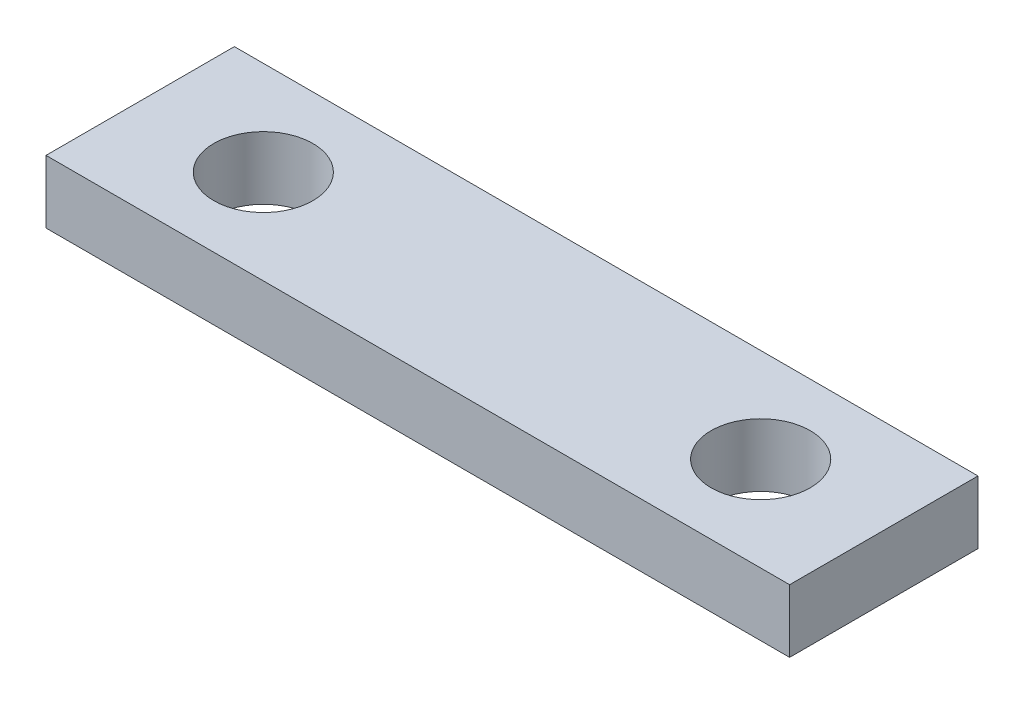
ISO-10303-21;
HEADER;
FILE_DESCRIPTION(('STEP AP214'),'2;1');
FILE_NAME('part.step','',(''),(''),'','','');
FILE_SCHEMA(('AUTOMOTIVE_DESIGN { 1 0 10303 214 1 1 1 1 }'));
ENDSEC;
DATA;
#1=APPLICATION_CONTEXT('core data for automotive mechanical design processes');
#2=APPLICATION_PROTOCOL_DEFINITION('international standard','automotive_design',2000,#1);
#3=PRODUCT_CONTEXT('',#1,'mechanical');
#4=PRODUCT('Part','Part','',(#3));
#5=PRODUCT_RELATED_PRODUCT_CATEGORY('part','',(#4));
#6=PRODUCT_DEFINITION_FORMATION('','',#4);
#7=PRODUCT_DEFINITION_CONTEXT('part definition',#1,'design');
#8=PRODUCT_DEFINITION('design','',#6,#7);
#9=PRODUCT_DEFINITION_SHAPE('','',#8);
#10=(LENGTH_UNIT() NAMED_UNIT(*) SI_UNIT(.MILLI.,.METRE.));
#11=(NAMED_UNIT(*) PLANE_ANGLE_UNIT() SI_UNIT($,.RADIAN.));
#12=(NAMED_UNIT(*) SI_UNIT($,.STERADIAN.) SOLID_ANGLE_UNIT());
#13=UNCERTAINTY_MEASURE_WITH_UNIT(LENGTH_MEASURE(1.E-05),#10,'distance_accuracy_value','');
#14=(GEOMETRIC_REPRESENTATION_CONTEXT(3) GLOBAL_UNCERTAINTY_ASSIGNED_CONTEXT((#13)) GLOBAL_UNIT_ASSIGNED_CONTEXT((#10,
#11,#12)) REPRESENTATION_CONTEXT('',''));
#15=CARTESIAN_POINT('',(0.,0.,0.));
#16=DIRECTION('',(0.,0.,1.));
#17=DIRECTION('',(1.,0.,0.));
#18=AXIS2_PLACEMENT_3D('',#15,#16,#17);
#19=CARTESIAN_POINT('',(0.,6.35,0.));
#20=DIRECTION('',(0.,-1.,0.));
#21=DIRECTION('',(0.,0.,-1.));
#22=AXIS2_PLACEMENT_3D('',#19,#20,#21);
#23=PLANE('',#22);
#24=DIRECTION('',(0.,0.,-1.));
#25=VECTOR('',#24,1.);
#26=CARTESIAN_POINT('',(0.,6.35,0.));
#27=LINE('',#26,#25);
#28=CARTESIAN_POINT('',(0.,6.35,19.));
#29=VERTEX_POINT('',#28);
#30=CARTESIAN_POINT('',(0.,6.35,0.));
#31=VERTEX_POINT('',#30);
#32=EDGE_CURVE('E92',#29,#31,#27,.T.);
#33=ORIENTED_EDGE('',*,*,#32,.T.);
#34=DIRECTION('',(-1.,0.,0.));
#35=VECTOR('',#34,1.);
#36=CARTESIAN_POINT('',(0.,6.35,0.));
#37=LINE('',#36,#35);
#38=CARTESIAN_POINT('',(-75.,6.35,0.));
#39=VERTEX_POINT('',#38);
#40=EDGE_CURVE('E87',#31,#39,#37,.T.);
#41=ORIENTED_EDGE('',*,*,#40,.T.);
#42=DIRECTION('',(0.,0.,1.));
#43=VECTOR('',#42,1.);
#44=CARTESIAN_POINT('',(-75.,6.35,0.));
#45=LINE('',#44,#43);
#46=CARTESIAN_POINT('',(-75.,6.35,19.));
#47=VERTEX_POINT('',#46);
#48=EDGE_CURVE('E90',#39,#47,#45,.T.);
#49=ORIENTED_EDGE('',*,*,#48,.T.);
#50=DIRECTION('',(1.,0.,0.));
#51=VECTOR('',#50,1.);
#52=CARTESIAN_POINT('',(0.,6.35,19.));
#53=LINE('',#52,#51);
#54=EDGE_CURVE('E57',#47,#29,#53,.T.);
#55=ORIENTED_EDGE('',*,*,#54,.T.);
#56=EDGE_LOOP('',(#33,#41,#49,#55));
#57=FACE_BOUND('',#56,.T.);
#58=CARTESIAN_POINT('',(-62.58,6.35,9.50000000000001));
#59=DIRECTION('',(0.,1.,0.));
#60=DIRECTION('',(0.,0.,1.));
#61=AXIS2_PLACEMENT_3D('',#58,#59,#60);
#62=CIRCLE('',#61,5.);
#63=CARTESIAN_POINT('',(-62.58,6.35,14.5));
#64=VERTEX_POINT('',#63);
#65=EDGE_CURVE('E112',#64,#64,#62,.T.);
#66=ORIENTED_EDGE('',*,*,#65,.F.);
#67=EDGE_LOOP('',(#66));
#68=FACE_BOUND('',#67,.T.);
#69=CARTESIAN_POINT('',(-12.42,6.35,9.50000000000001));
#70=DIRECTION('',(0.,1.,0.));
#71=DIRECTION('',(0.,0.,1.));
#72=AXIS2_PLACEMENT_3D('',#69,#70,#71);
#73=CIRCLE('',#72,5.);
#74=CARTESIAN_POINT('',(-12.42,6.35,14.5));
#75=VERTEX_POINT('',#74);
#76=EDGE_CURVE('E134',#75,#75,#73,.T.);
#77=ORIENTED_EDGE('',*,*,#76,.F.);
#78=EDGE_LOOP('',(#77));
#79=FACE_BOUND('',#78,.T.);
#80=ADVANCED_FACE('F39',(#57,#68,#79),#23,.F.);
#81=CARTESIAN_POINT('',(0.,0.,0.));
#82=DIRECTION('',(0.,-1.,0.));
#83=DIRECTION('',(0.,0.,-1.));
#84=AXIS2_PLACEMENT_3D('',#81,#82,#83);
#85=PLANE('',#84);
#86=CARTESIAN_POINT('',(-62.58,0.,9.50000000000001));
#87=DIRECTION('',(0.,1.,0.));
#88=DIRECTION('',(0.,0.,1.));
#89=AXIS2_PLACEMENT_3D('',#86,#87,#88);
#90=CIRCLE('',#89,5.);
#91=CARTESIAN_POINT('',(-62.58,0.,14.5));
#92=VERTEX_POINT('',#91);
#93=EDGE_CURVE('E130',#92,#92,#90,.T.);
#94=ORIENTED_EDGE('',*,*,#93,.T.);
#95=EDGE_LOOP('',(#94));
#96=FACE_BOUND('',#95,.T.);
#97=DIRECTION('',(0.,0.,-1.));
#98=VECTOR('',#97,1.);
#99=CARTESIAN_POINT('',(0.,0.,0.));
#100=LINE('',#99,#98);
#101=CARTESIAN_POINT('',(0.,0.,19.));
#102=VERTEX_POINT('',#101);
#103=CARTESIAN_POINT('',(0.,0.,0.));
#104=VERTEX_POINT('',#103);
#105=EDGE_CURVE('E108',#102,#104,#100,.T.);
#106=ORIENTED_EDGE('',*,*,#105,.F.);
#107=DIRECTION('',(1.,0.,0.));
#108=VECTOR('',#107,1.);
#109=CARTESIAN_POINT('',(0.,0.,19.));
#110=LINE('',#109,#108);
#111=CARTESIAN_POINT('',(-75.,0.,19.));
#112=VERTEX_POINT('',#111);
#113=EDGE_CURVE('E80',#112,#102,#110,.T.);
#114=ORIENTED_EDGE('',*,*,#113,.F.);
#115=DIRECTION('',(0.,0.,1.));
#116=VECTOR('',#115,1.);
#117=CARTESIAN_POINT('',(-75.,0.,0.));
#118=LINE('',#117,#116);
#119=CARTESIAN_POINT('',(-75.,0.,0.));
#120=VERTEX_POINT('',#119);
#121=EDGE_CURVE('E74',#120,#112,#118,.T.);
#122=ORIENTED_EDGE('',*,*,#121,.F.);
#123=DIRECTION('',(-1.,0.,0.));
#124=VECTOR('',#123,1.);
#125=CARTESIAN_POINT('',(0.,0.,0.));
#126=LINE('',#125,#124);
#127=EDGE_CURVE('E97',#104,#120,#126,.T.);
#128=ORIENTED_EDGE('',*,*,#127,.F.);
#129=EDGE_LOOP('',(#106,#114,#122,#128));
#130=FACE_BOUND('',#129,.T.);
#131=CARTESIAN_POINT('',(-12.42,0.,9.50000000000001));
#132=DIRECTION('',(0.,1.,0.));
#133=DIRECTION('',(0.,0.,1.));
#134=AXIS2_PLACEMENT_3D('',#131,#132,#133);
#135=CIRCLE('',#134,5.);
#136=CARTESIAN_POINT('',(-12.42,0.,14.5));
#137=VERTEX_POINT('',#136);
#138=EDGE_CURVE('E138',#137,#137,#135,.T.);
#139=ORIENTED_EDGE('',*,*,#138,.T.);
#140=EDGE_LOOP('',(#139));
#141=FACE_BOUND('',#140,.T.);
#142=ADVANCED_FACE('F125',(#96,#130,#141),#85,.T.);
#143=CARTESIAN_POINT('',(0.,6.35,0.));
#144=DIRECTION('',(-1.,0.,0.));
#145=DIRECTION('',(0.,0.,1.));
#146=AXIS2_PLACEMENT_3D('',#143,#144,#145);
#147=PLANE('',#146);
#148=ORIENTED_EDGE('',*,*,#105,.T.);
#149=DIRECTION('',(0.,-1.,0.));
#150=VECTOR('',#149,1.);
#151=CARTESIAN_POINT('',(0.,6.35,0.));
#152=LINE('',#151,#150);
#153=EDGE_CURVE('E11',#31,#104,#152,.T.);
#154=ORIENTED_EDGE('',*,*,#153,.F.);
#155=ORIENTED_EDGE('',*,*,#32,.F.);
#156=DIRECTION('',(0.,-1.,0.));
#157=VECTOR('',#156,1.);
#158=CARTESIAN_POINT('',(0.,6.35,19.));
#159=LINE('',#158,#157);
#160=EDGE_CURVE('E104',#29,#102,#159,.T.);
#161=ORIENTED_EDGE('',*,*,#160,.T.);
#162=EDGE_LOOP('',(#148,#154,#155,#161));
#163=FACE_BOUND('',#162,.T.);
#164=ADVANCED_FACE('F41',(#163),#147,.F.);
#165=CARTESIAN_POINT('',(0.,6.35,0.));
#166=DIRECTION('',(0.,0.,1.));
#167=DIRECTION('',(1.,0.,0.));
#168=AXIS2_PLACEMENT_3D('',#165,#166,#167);
#169=PLANE('',#168);
#170=ORIENTED_EDGE('',*,*,#127,.T.);
#171=DIRECTION('',(0.,-1.,0.));
#172=VECTOR('',#171,1.);
#173=CARTESIAN_POINT('',(-75.,6.35,0.));
#174=LINE('',#173,#172);
#175=EDGE_CURVE('E49',#39,#120,#174,.T.);
#176=ORIENTED_EDGE('',*,*,#175,.F.);
#177=ORIENTED_EDGE('',*,*,#40,.F.);
#178=ORIENTED_EDGE('',*,*,#153,.T.);
#179=EDGE_LOOP('',(#170,#176,#177,#178));
#180=FACE_BOUND('',#179,.T.);
#181=ADVANCED_FACE('F96',(#180),#169,.F.);
#182=CARTESIAN_POINT('',(-75.,6.35,0.));
#183=DIRECTION('',(1.,0.,0.));
#184=DIRECTION('',(0.,0.,-1.));
#185=AXIS2_PLACEMENT_3D('',#182,#183,#184);
#186=PLANE('',#185);
#187=ORIENTED_EDGE('',*,*,#121,.T.);
#188=DIRECTION('',(0.,-1.,0.));
#189=VECTOR('',#188,1.);
#190=CARTESIAN_POINT('',(-75.,6.35,19.));
#191=LINE('',#190,#189);
#192=EDGE_CURVE('E99',#47,#112,#191,.T.);
#193=ORIENTED_EDGE('',*,*,#192,.F.);
#194=ORIENTED_EDGE('',*,*,#48,.F.);
#195=ORIENTED_EDGE('',*,*,#175,.T.);
#196=EDGE_LOOP('',(#187,#193,#194,#195));
#197=FACE_BOUND('',#196,.T.);
#198=ADVANCED_FACE('F100',(#197),#186,.F.);
#199=CARTESIAN_POINT('',(0.,6.35,19.));
#200=DIRECTION('',(0.,0.,-1.));
#201=DIRECTION('',(-1.,0.,0.));
#202=AXIS2_PLACEMENT_3D('',#199,#200,#201);
#203=PLANE('',#202);
#204=ORIENTED_EDGE('',*,*,#113,.T.);
#205=ORIENTED_EDGE('',*,*,#160,.F.);
#206=ORIENTED_EDGE('',*,*,#54,.F.);
#207=ORIENTED_EDGE('',*,*,#192,.T.);
#208=EDGE_LOOP('',(#204,#205,#206,#207));
#209=FACE_BOUND('',#208,.T.);
#210=ADVANCED_FACE('F122',(#209),#203,.F.);
#211=CARTESIAN_POINT('',(-62.58,6.35,9.50000000000001));
#212=DIRECTION('',(0.,-1.,0.));
#213=DIRECTION('',(0.,0.,-1.));
#214=AXIS2_PLACEMENT_3D('',#211,#212,#213);
#215=CYLINDRICAL_SURFACE('',#214,5.);
#216=ORIENTED_EDGE('',*,*,#65,.T.);
#217=EDGE_LOOP('',(#216));
#218=FACE_BOUND('',#217,.T.);
#219=ORIENTED_EDGE('',*,*,#93,.F.);
#220=EDGE_LOOP('',(#219));
#221=FACE_BOUND('',#220,.T.);
#222=ADVANCED_FACE('F157',(#218,#221),#215,.F.);
#223=CARTESIAN_POINT('',(-12.42,6.35,9.50000000000001));
#224=DIRECTION('',(0.,-1.,0.));
#225=DIRECTION('',(0.,0.,-1.));
#226=AXIS2_PLACEMENT_3D('',#223,#224,#225);
#227=CYLINDRICAL_SURFACE('',#226,5.);
#228=ORIENTED_EDGE('',*,*,#76,.T.);
#229=EDGE_LOOP('',(#228));
#230=FACE_BOUND('',#229,.T.);
#231=ORIENTED_EDGE('',*,*,#138,.F.);
#232=EDGE_LOOP('',(#231));
#233=FACE_BOUND('',#232,.T.);
#234=ADVANCED_FACE('F146',(#230,#233),#227,.F.);
#235=CLOSED_SHELL('',(#80,#142,#164,#181,#198,#210,#222,#234));
#236=MANIFOLD_SOLID_BREP('B2',#235);
#237=ADVANCED_BREP_SHAPE_REPRESENTATION('',(#18,#236),#14);
#238=SHAPE_DEFINITION_REPRESENTATION(#9,#237);
ENDSEC;
END-ISO-10303-21;
